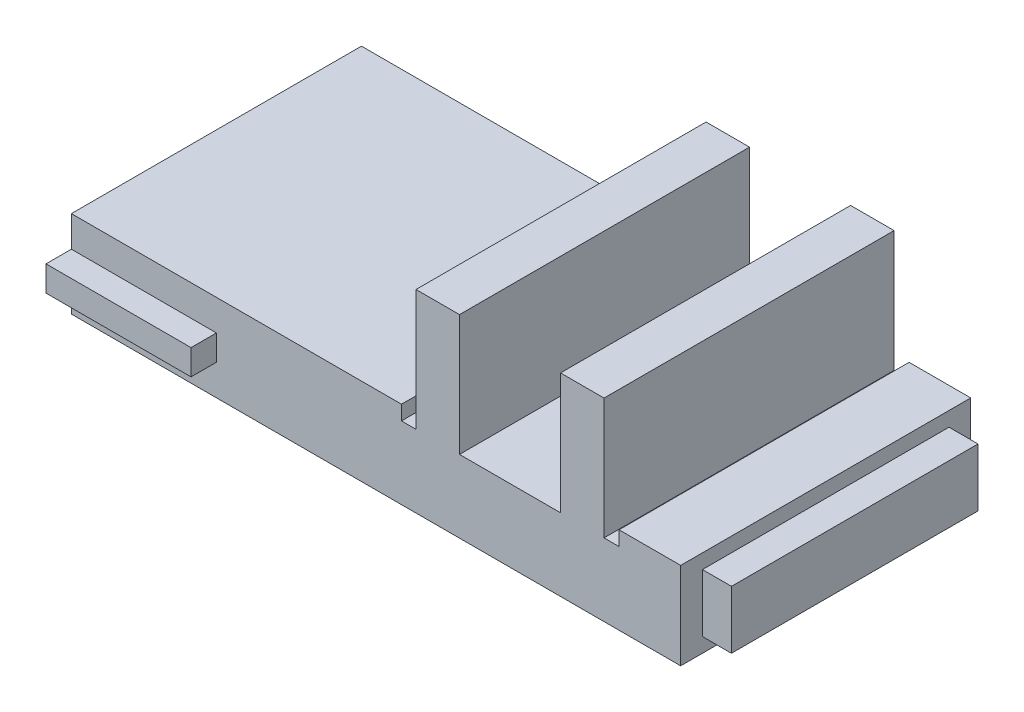
ISO-10303-21;
HEADER;
FILE_DESCRIPTION(('STEP AP214'),'2;1');
FILE_NAME('part.step','',(''),(''),'','','');
FILE_SCHEMA(('AUTOMOTIVE_DESIGN { 1 0 10303 214 1 1 1 1 }'));
ENDSEC;
DATA;
#1=APPLICATION_CONTEXT('core data for automotive mechanical design processes');
#2=APPLICATION_PROTOCOL_DEFINITION('international standard','automotive_design',2000,#1);
#3=PRODUCT_CONTEXT('',#1,'mechanical');
#4=PRODUCT('Part','Part','',(#3));
#5=PRODUCT_RELATED_PRODUCT_CATEGORY('part','',(#4));
#6=PRODUCT_DEFINITION_FORMATION('','',#4);
#7=PRODUCT_DEFINITION_CONTEXT('part definition',#1,'design');
#8=PRODUCT_DEFINITION('design','',#6,#7);
#9=PRODUCT_DEFINITION_SHAPE('','',#8);
#10=(LENGTH_UNIT() NAMED_UNIT(*) SI_UNIT(.MILLI.,.METRE.));
#11=(NAMED_UNIT(*) PLANE_ANGLE_UNIT() SI_UNIT($,.RADIAN.));
#12=(NAMED_UNIT(*) SI_UNIT($,.STERADIAN.) SOLID_ANGLE_UNIT());
#13=UNCERTAINTY_MEASURE_WITH_UNIT(LENGTH_MEASURE(1.E-05),#10,'distance_accuracy_value','');
#14=(GEOMETRIC_REPRESENTATION_CONTEXT(3) GLOBAL_UNCERTAINTY_ASSIGNED_CONTEXT((#13)) GLOBAL_UNIT_ASSIGNED_CONTEXT((#10,
#11,#12)) REPRESENTATION_CONTEXT('',''));
#15=CARTESIAN_POINT('',(0.,0.,0.));
#16=DIRECTION('',(0.,0.,1.));
#17=DIRECTION('',(1.,0.,0.));
#18=AXIS2_PLACEMENT_3D('',#15,#16,#17);
#19=CARTESIAN_POINT('',(0.,0.,0.));
#20=DIRECTION('',(0.,0.,1.));
#21=DIRECTION('',(1.,0.,0.));
#22=AXIS2_PLACEMENT_3D('',#19,#20,#21);
#23=PLANE('',#22);
#24=DIRECTION('',(-1.,0.,0.));
#25=VECTOR('',#24,1.);
#26=CARTESIAN_POINT('',(-20.26,-2.875,0.));
#27=LINE('',#26,#25);
#28=CARTESIAN_POINT('',(-20.26,-2.875,0.));
#29=VERTEX_POINT('',#28);
#30=CARTESIAN_POINT('',(-30.26,-2.875,0.));
#31=VERTEX_POINT('',#30);
#32=EDGE_CURVE('E301',#29,#31,#27,.T.);
#33=ORIENTED_EDGE('',*,*,#32,.F.);
#34=DIRECTION('',(0.,1.,0.));
#35=VECTOR('',#34,1.);
#36=CARTESIAN_POINT('',(-20.26,-1.125,0.));
#37=LINE('',#36,#35);
#38=CARTESIAN_POINT('',(-20.26,-1.125,0.));
#39=VERTEX_POINT('',#38);
#40=EDGE_CURVE('E274',#29,#39,#37,.T.);
#41=ORIENTED_EDGE('',*,*,#40,.T.);
#42=DIRECTION('',(-1.,0.,0.));
#43=VECTOR('',#42,1.);
#44=CARTESIAN_POINT('',(-20.26,-1.125,0.));
#45=LINE('',#44,#43);
#46=CARTESIAN_POINT('',(-30.26,-1.125,0.));
#47=VERTEX_POINT('',#46);
#48=EDGE_CURVE('E291',#39,#47,#45,.T.);
#49=ORIENTED_EDGE('',*,*,#48,.T.);
#50=DIRECTION('',(0.,-1.,0.));
#51=VECTOR('',#50,1.);
#52=CARTESIAN_POINT('',(-30.26,0.999999999999995,0.));
#53=LINE('',#52,#51);
#54=CARTESIAN_POINT('',(-30.26,0.999999999999995,0.));
#55=VERTEX_POINT('',#54);
#56=EDGE_CURVE('E470',#55,#47,#53,.T.);
#57=ORIENTED_EDGE('',*,*,#56,.F.);
#58=DIRECTION('',(-1.,0.,0.));
#59=VECTOR('',#58,1.);
#60=CARTESIAN_POINT('',(-7.5,0.999999999999998,0.));
#61=LINE('',#60,#59);
#62=CARTESIAN_POINT('',(-7.5,0.999999999999998,0.));
#63=VERTEX_POINT('',#62);
#64=EDGE_CURVE('E466',#63,#55,#61,.T.);
#65=ORIENTED_EDGE('',*,*,#64,.F.);
#66=DIRECTION('',(0.,1.,0.));
#67=VECTOR('',#66,1.);
#68=CARTESIAN_POINT('',(-7.5,0.,0.));
#69=LINE('',#68,#67);
#70=CARTESIAN_POINT('',(-7.5,0.,0.));
#71=VERTEX_POINT('',#70);
#72=EDGE_CURVE('E431',#71,#63,#69,.T.);
#73=ORIENTED_EDGE('',*,*,#72,.F.);
#74=DIRECTION('',(-1.,0.,0.));
#75=VECTOR('',#74,1.);
#76=CARTESIAN_POINT('',(7.5,0.,0.));
#77=LINE('',#76,#75);
#78=CARTESIAN_POINT('',(-6.5,0.,0.));
#79=VERTEX_POINT('',#78);
#80=EDGE_CURVE('E485',#79,#71,#77,.T.);
#81=ORIENTED_EDGE('',*,*,#80,.F.);
#82=DIRECTION('',(0.,-1.,0.));
#83=VECTOR('',#82,1.);
#84=CARTESIAN_POINT('',(-6.5,8.35,0.));
#85=LINE('',#84,#83);
#86=CARTESIAN_POINT('',(-6.5,8.35,0.));
#87=VERTEX_POINT('',#86);
#88=EDGE_CURVE('E378',#87,#79,#85,.T.);
#89=ORIENTED_EDGE('',*,*,#88,.F.);
#90=DIRECTION('',(-1.,0.,0.));
#91=VECTOR('',#90,1.);
#92=CARTESIAN_POINT('',(-6.5,8.35,0.));
#93=LINE('',#92,#91);
#94=CARTESIAN_POINT('',(-3.5,8.35,0.));
#95=VERTEX_POINT('',#94);
#96=EDGE_CURVE('E354',#95,#87,#93,.T.);
#97=ORIENTED_EDGE('',*,*,#96,.F.);
#98=DIRECTION('',(0.,-1.,0.));
#99=VECTOR('',#98,1.);
#100=CARTESIAN_POINT('',(-3.5,8.35,0.));
#101=LINE('',#100,#99);
#102=CARTESIAN_POINT('',(-3.5,0.,0.));
#103=VERTEX_POINT('',#102);
#104=EDGE_CURVE('E382',#95,#103,#101,.T.);
#105=ORIENTED_EDGE('',*,*,#104,.T.);
#106=CARTESIAN_POINT('',(3.46586818251866,0.,0.));
#107=VERTEX_POINT('',#106);
#108=EDGE_CURVE('E488',#107,#103,#77,.T.);
#109=ORIENTED_EDGE('',*,*,#108,.F.);
#110=DIRECTION('',(0.,-1.,0.));
#111=VECTOR('',#110,1.);
#112=CARTESIAN_POINT('',(3.46586818251866,8.35,0.));
#113=LINE('',#112,#111);
#114=CARTESIAN_POINT('',(3.46586818251866,8.35,0.));
#115=VERTEX_POINT('',#114);
#116=EDGE_CURVE('E316',#115,#107,#113,.T.);
#117=ORIENTED_EDGE('',*,*,#116,.F.);
#118=DIRECTION('',(-1.,0.,0.));
#119=VECTOR('',#118,1.);
#120=CARTESIAN_POINT('',(3.46586818251866,8.35,0.));
#121=LINE('',#120,#119);
#122=CARTESIAN_POINT('',(6.46586818251866,8.35,0.));
#123=VERTEX_POINT('',#122);
#124=EDGE_CURVE('E344',#123,#115,#121,.T.);
#125=ORIENTED_EDGE('',*,*,#124,.F.);
#126=DIRECTION('',(0.,-1.,0.));
#127=VECTOR('',#126,1.);
#128=CARTESIAN_POINT('',(6.46586818251866,8.35,0.));
#129=LINE('',#128,#127);
#130=CARTESIAN_POINT('',(6.46586818251867,0.,0.));
#131=VERTEX_POINT('',#130);
#132=EDGE_CURVE('E304',#123,#131,#129,.T.);
#133=ORIENTED_EDGE('',*,*,#132,.T.);
#134=CARTESIAN_POINT('',(7.5,0.,0.));
#135=VERTEX_POINT('',#134);
#136=EDGE_CURVE('E437',#135,#131,#77,.T.);
#137=ORIENTED_EDGE('',*,*,#136,.F.);
#138=DIRECTION('',(0.,-1.,0.));
#139=VECTOR('',#138,1.);
#140=CARTESIAN_POINT('',(7.5,1.,0.));
#141=LINE('',#140,#139);
#142=CARTESIAN_POINT('',(7.5,1.,0.));
#143=VERTEX_POINT('',#142);
#144=EDGE_CURVE('E482',#143,#135,#141,.T.);
#145=ORIENTED_EDGE('',*,*,#144,.F.);
#146=DIRECTION('',(-1.,0.,0.));
#147=VECTOR('',#146,1.);
#148=CARTESIAN_POINT('',(11.75,1.,0.));
#149=LINE('',#148,#147);
#150=CARTESIAN_POINT('',(11.75,1.,0.));
#151=VERTEX_POINT('',#150);
#152=EDGE_CURVE('E479',#151,#143,#149,.T.);
#153=ORIENTED_EDGE('',*,*,#152,.F.);
#154=DIRECTION('',(0.,1.,0.));
#155=VECTOR('',#154,1.);
#156=CARTESIAN_POINT('',(11.75,-5.,0.));
#157=LINE('',#156,#155);
#158=CARTESIAN_POINT('',(11.75,-5.,0.));
#159=VERTEX_POINT('',#158);
#160=EDGE_CURVE('E476',#159,#151,#157,.T.);
#161=ORIENTED_EDGE('',*,*,#160,.F.);
#162=DIRECTION('',(1.,0.,0.));
#163=VECTOR('',#162,1.);
#164=CARTESIAN_POINT('',(-30.26,-5.,0.));
#165=LINE('',#164,#163);
#166=CARTESIAN_POINT('',(-30.26,-5.,0.));
#167=VERTEX_POINT('',#166);
#168=EDGE_CURVE('E473',#167,#159,#165,.T.);
#169=ORIENTED_EDGE('',*,*,#168,.F.);
#170=EDGE_CURVE('E469',#31,#167,#53,.T.);
#171=ORIENTED_EDGE('',*,*,#170,.F.);
#172=EDGE_LOOP('',(#33,#41,#49,#57,#65,#73,#81,#89,#97,#105,#109,#117,#125,#133,#137,#145,#153,
#161,#169,#171));
#173=FACE_BOUND('',#172,.T.);
#174=ADVANCED_FACE('F45',(#173),#23,.F.);
#175=CARTESIAN_POINT('',(7.5,0.,20.));
#176=DIRECTION('',(0.,-1.,0.));
#177=DIRECTION('',(1.,0.,0.));
#178=AXIS2_PLACEMENT_3D('',#175,#176,#177);
#179=PLANE('',#178);
#180=DIRECTION('',(0.,0.,-1.));
#181=VECTOR('',#180,1.);
#182=CARTESIAN_POINT('',(6.46586818251866,0.,0.));
#183=LINE('',#182,#181);
#184=CARTESIAN_POINT('',(6.46586818251867,0.,20.));
#185=VERTEX_POINT('',#184);
#186=EDGE_CURVE('E333',#185,#131,#183,.T.);
#187=ORIENTED_EDGE('',*,*,#186,.F.);
#188=DIRECTION('',(-1.,0.,0.));
#189=VECTOR('',#188,1.);
#190=CARTESIAN_POINT('',(7.5,0.,20.));
#191=LINE('',#190,#189);
#192=CARTESIAN_POINT('',(7.5,0.,20.));
#193=VERTEX_POINT('',#192);
#194=EDGE_CURVE('E457',#193,#185,#191,.T.);
#195=ORIENTED_EDGE('',*,*,#194,.F.);
#196=DIRECTION('',(0.,0.,-1.));
#197=VECTOR('',#196,1.);
#198=CARTESIAN_POINT('',(7.5,0.,20.));
#199=LINE('',#198,#197);
#200=EDGE_CURVE('E492',#193,#135,#199,.T.);
#201=ORIENTED_EDGE('',*,*,#200,.T.);
#202=ORIENTED_EDGE('',*,*,#136,.T.);
#203=EDGE_LOOP('',(#187,#195,#201,#202));
#204=FACE_BOUND('',#203,.T.);
#205=ADVANCED_FACE('F586',(#204),#179,.F.);
#206=DIRECTION('',(0.,0.,1.));
#207=VECTOR('',#206,1.);
#208=CARTESIAN_POINT('',(3.46586818251866,0.,0.));
#209=LINE('',#208,#207);
#210=CARTESIAN_POINT('',(3.46586818251866,0.,20.));
#211=VERTEX_POINT('',#210);
#212=EDGE_CURVE('E329',#107,#211,#209,.T.);
#213=ORIENTED_EDGE('',*,*,#212,.F.);
#214=ORIENTED_EDGE('',*,*,#108,.T.);
#215=DIRECTION('',(0.,0.,-1.));
#216=VECTOR('',#215,1.);
#217=CARTESIAN_POINT('',(-3.5,0.,0.));
#218=LINE('',#217,#216);
#219=CARTESIAN_POINT('',(-3.5,0.,20.));
#220=VERTEX_POINT('',#219);
#221=EDGE_CURVE('E338',#220,#103,#218,.T.);
#222=ORIENTED_EDGE('',*,*,#221,.F.);
#223=EDGE_CURVE('E462',#211,#220,#191,.T.);
#224=ORIENTED_EDGE('',*,*,#223,.F.);
#225=EDGE_LOOP('',(#213,#214,#222,#224));
#226=FACE_BOUND('',#225,.T.);
#227=ADVANCED_FACE('F552',(#226),#179,.F.);
#228=DIRECTION('',(0.,0.,1.));
#229=VECTOR('',#228,1.);
#230=CARTESIAN_POINT('',(-6.5,0.,0.));
#231=LINE('',#230,#229);
#232=CARTESIAN_POINT('',(-6.5,0.,20.));
#233=VERTEX_POINT('',#232);
#234=EDGE_CURVE('E355',#79,#233,#231,.T.);
#235=ORIENTED_EDGE('',*,*,#234,.F.);
#236=ORIENTED_EDGE('',*,*,#80,.T.);
#237=DIRECTION('',(0.,0.,-1.));
#238=VECTOR('',#237,1.);
#239=CARTESIAN_POINT('',(-7.5,0.,20.));
#240=LINE('',#239,#238);
#241=CARTESIAN_POINT('',(-7.5,0.,20.));
#242=VERTEX_POINT('',#241);
#243=EDGE_CURVE('E461',#242,#71,#240,.T.);
#244=ORIENTED_EDGE('',*,*,#243,.F.);
#245=EDGE_CURVE('E456',#233,#242,#191,.T.);
#246=ORIENTED_EDGE('',*,*,#245,.F.);
#247=EDGE_LOOP('',(#235,#236,#244,#246));
#248=FACE_BOUND('',#247,.T.);
#249=ADVANCED_FACE('F566',(#248),#179,.F.);
#250=CARTESIAN_POINT('',(11.75,-5.,20.));
#251=DIRECTION('',(-1.,0.,0.));
#252=DIRECTION('',(0.,0.,1.));
#253=AXIS2_PLACEMENT_3D('',#250,#251,#252);
#254=PLANE('',#253);
#255=ORIENTED_EDGE('',*,*,#160,.T.);
#256=DIRECTION('',(0.,0.,-1.));
#257=VECTOR('',#256,1.);
#258=CARTESIAN_POINT('',(11.75,1.,20.));
#259=LINE('',#258,#257);
#260=CARTESIAN_POINT('',(11.75,1.,20.));
#261=VERTEX_POINT('',#260);
#262=EDGE_CURVE('E500',#261,#151,#259,.T.);
#263=ORIENTED_EDGE('',*,*,#262,.F.);
#264=DIRECTION('',(0.,1.,0.));
#265=VECTOR('',#264,1.);
#266=CARTESIAN_POINT('',(11.75,-5.,20.));
#267=LINE('',#266,#265);
#268=CARTESIAN_POINT('',(11.75,-5.,20.));
#269=VERTEX_POINT('',#268);
#270=EDGE_CURVE('E447',#269,#261,#267,.T.);
#271=ORIENTED_EDGE('',*,*,#270,.F.);
#272=DIRECTION('',(0.,0.,-1.));
#273=VECTOR('',#272,1.);
#274=CARTESIAN_POINT('',(11.75,-5.,20.));
#275=LINE('',#274,#273);
#276=EDGE_CURVE('E504',#269,#159,#275,.T.);
#277=ORIENTED_EDGE('',*,*,#276,.T.);
#278=EDGE_LOOP('',(#255,#263,#271,#277));
#279=FACE_BOUND('',#278,.T.);
#280=DIRECTION('',(0.,1.,0.));
#281=VECTOR('',#280,1.);
#282=CARTESIAN_POINT('',(11.75,0.,1.5));
#283=LINE('',#282,#281);
#284=CARTESIAN_POINT('',(11.75,-4.,1.5));
#285=VERTEX_POINT('',#284);
#286=CARTESIAN_POINT('',(11.75,0.,1.5));
#287=VERTEX_POINT('',#286);
#288=EDGE_CURVE('E386',#285,#287,#283,.T.);
#289=ORIENTED_EDGE('',*,*,#288,.F.);
#290=DIRECTION('',(0.,0.,-1.));
#291=VECTOR('',#290,1.);
#292=CARTESIAN_POINT('',(11.75,-4.,18.5));
#293=LINE('',#292,#291);
#294=CARTESIAN_POINT('',(11.75,-4.,18.5));
#295=VERTEX_POINT('',#294);
#296=EDGE_CURVE('E392',#295,#285,#293,.T.);
#297=ORIENTED_EDGE('',*,*,#296,.F.);
#298=DIRECTION('',(0.,-1.,0.));
#299=VECTOR('',#298,1.);
#300=CARTESIAN_POINT('',(11.75,0.,18.5));
#301=LINE('',#300,#299);
#302=CARTESIAN_POINT('',(11.75,0.,18.5));
#303=VERTEX_POINT('',#302);
#304=EDGE_CURVE('E409',#303,#295,#301,.T.);
#305=ORIENTED_EDGE('',*,*,#304,.F.);
#306=DIRECTION('',(0.,0.,1.));
#307=VECTOR('',#306,1.);
#308=CARTESIAN_POINT('',(11.75,0.,18.5));
#309=LINE('',#308,#307);
#310=EDGE_CURVE('E405',#287,#303,#309,.T.);
#311=ORIENTED_EDGE('',*,*,#310,.F.);
#312=EDGE_LOOP('',(#289,#297,#305,#311));
#313=FACE_BOUND('',#312,.T.);
#314=ADVANCED_FACE('F599',(#279,#313),#254,.F.);
#315=CARTESIAN_POINT('',(-7.5,0.,20.));
#316=DIRECTION('',(-1.,0.,0.));
#317=DIRECTION('',(0.,-1.,0.));
#318=AXIS2_PLACEMENT_3D('',#315,#316,#317);
#319=PLANE('',#318);
#320=ORIENTED_EDGE('',*,*,#72,.T.);
#321=DIRECTION('',(0.,0.,-1.));
#322=VECTOR('',#321,1.);
#323=CARTESIAN_POINT('',(-7.5,0.999999999999998,20.));
#324=LINE('',#323,#322);
#325=CARTESIAN_POINT('',(-7.5,0.999999999999998,20.));
#326=VERTEX_POINT('',#325);
#327=EDGE_CURVE('E11',#326,#63,#324,.T.);
#328=ORIENTED_EDGE('',*,*,#327,.F.);
#329=DIRECTION('',(0.,1.,0.));
#330=VECTOR('',#329,1.);
#331=CARTESIAN_POINT('',(-7.5,0.,20.));
#332=LINE('',#331,#330);
#333=EDGE_CURVE('E432',#242,#326,#332,.T.);
#334=ORIENTED_EDGE('',*,*,#333,.F.);
#335=ORIENTED_EDGE('',*,*,#243,.T.);
#336=EDGE_LOOP('',(#320,#328,#334,#335));
#337=FACE_BOUND('',#336,.T.);
#338=ADVANCED_FACE('F47',(#337),#319,.F.);
#339=CARTESIAN_POINT('',(-7.5,0.999999999999998,20.));
#340=DIRECTION('',(0.,-1.,0.));
#341=DIRECTION('',(1.,0.,0.));
#342=AXIS2_PLACEMENT_3D('',#339,#340,#341);
#343=PLANE('',#342);
#344=ORIENTED_EDGE('',*,*,#64,.T.);
#345=DIRECTION('',(0.,0.,-1.));
#346=VECTOR('',#345,1.);
#347=CARTESIAN_POINT('',(-30.26,0.999999999999995,20.));
#348=LINE('',#347,#346);
#349=CARTESIAN_POINT('',(-30.26,0.999999999999995,20.));
#350=VERTEX_POINT('',#349);
#351=EDGE_CURVE('E54',#350,#55,#348,.T.);
#352=ORIENTED_EDGE('',*,*,#351,.F.);
#353=DIRECTION('',(-1.,0.,0.));
#354=VECTOR('',#353,1.);
#355=CARTESIAN_POINT('',(-7.5,0.999999999999998,20.));
#356=LINE('',#355,#354);
#357=EDGE_CURVE('E436',#326,#350,#356,.T.);
#358=ORIENTED_EDGE('',*,*,#357,.F.);
#359=ORIENTED_EDGE('',*,*,#327,.T.);
#360=EDGE_LOOP('',(#344,#352,#358,#359));
#361=FACE_BOUND('',#360,.T.);
#362=ADVANCED_FACE('F570',(#361),#343,.F.);
#363=CARTESIAN_POINT('',(-30.26,0.999999999999995,20.));
#364=DIRECTION('',(1.,0.,0.));
#365=DIRECTION('',(0.,0.,-1.));
#366=AXIS2_PLACEMENT_3D('',#363,#364,#365);
#367=PLANE('',#366);
#368=ORIENTED_EDGE('',*,*,#56,.T.);
#369=DIRECTION('',(0.,0.,-1.));
#370=VECTOR('',#369,1.);
#371=CARTESIAN_POINT('',(-30.26,-1.125,-1.75));
#372=LINE('',#371,#370);
#373=CARTESIAN_POINT('',(-30.26,-1.125,-1.75));
#374=VERTEX_POINT('',#373);
#375=EDGE_CURVE('E69',#47,#374,#372,.T.);
#376=ORIENTED_EDGE('',*,*,#375,.T.);
#377=DIRECTION('',(0.,-1.,0.));
#378=VECTOR('',#377,1.);
#379=CARTESIAN_POINT('',(-30.26,-1.125,-1.75));
#380=LINE('',#379,#378);
#381=CARTESIAN_POINT('',(-30.26,-2.875,-1.75));
#382=VERTEX_POINT('',#381);
#383=EDGE_CURVE('E294',#374,#382,#380,.T.);
#384=ORIENTED_EDGE('',*,*,#383,.T.);
#385=DIRECTION('',(0.,0.,1.));
#386=VECTOR('',#385,1.);
#387=CARTESIAN_POINT('',(-30.26,-2.875,-1.75));
#388=LINE('',#387,#386);
#389=EDGE_CURVE('E279',#382,#31,#388,.T.);
#390=ORIENTED_EDGE('',*,*,#389,.T.);
#391=ORIENTED_EDGE('',*,*,#170,.T.);
#392=DIRECTION('',(0.,0.,-1.));
#393=VECTOR('',#392,1.);
#394=CARTESIAN_POINT('',(-30.26,-5.,20.));
#395=LINE('',#394,#393);
#396=CARTESIAN_POINT('',(-30.26,-5.,20.));
#397=VERTEX_POINT('',#396);
#398=EDGE_CURVE('E508',#397,#167,#395,.T.);
#399=ORIENTED_EDGE('',*,*,#398,.F.);
#400=DIRECTION('',(0.,-1.,0.));
#401=VECTOR('',#400,1.);
#402=CARTESIAN_POINT('',(-30.26,0.999999999999995,20.));
#403=LINE('',#402,#401);
#404=CARTESIAN_POINT('',(-30.26,-2.875,20.));
#405=VERTEX_POINT('',#404);
#406=EDGE_CURVE('E254',#405,#397,#403,.T.);
#407=ORIENTED_EDGE('',*,*,#406,.F.);
#408=DIRECTION('',(0.,0.,1.));
#409=VECTOR('',#408,1.);
#410=CARTESIAN_POINT('',(-30.26,-2.875,21.75));
#411=LINE('',#410,#409);
#412=CARTESIAN_POINT('',(-30.26,-2.875,21.75));
#413=VERTEX_POINT('',#412);
#414=EDGE_CURVE('E61',#405,#413,#411,.T.);
#415=ORIENTED_EDGE('',*,*,#414,.T.);
#416=DIRECTION('',(0.,1.,0.));
#417=VECTOR('',#416,1.);
#418=CARTESIAN_POINT('',(-30.26,-1.125,21.75));
#419=LINE('',#418,#417);
#420=CARTESIAN_POINT('',(-30.26,-1.125,21.75));
#421=VERTEX_POINT('',#420);
#422=EDGE_CURVE('E241',#413,#421,#419,.T.);
#423=ORIENTED_EDGE('',*,*,#422,.T.);
#424=DIRECTION('',(0.,0.,-1.));
#425=VECTOR('',#424,1.);
#426=CARTESIAN_POINT('',(-30.26,-1.125,21.75));
#427=LINE('',#426,#425);
#428=CARTESIAN_POINT('',(-30.26,-1.125,20.));
#429=VERTEX_POINT('',#428);
#430=EDGE_CURVE('E248',#421,#429,#427,.T.);
#431=ORIENTED_EDGE('',*,*,#430,.T.);
#432=EDGE_CURVE('E440',#350,#429,#403,.T.);
#433=ORIENTED_EDGE('',*,*,#432,.F.);
#434=ORIENTED_EDGE('',*,*,#351,.T.);
#435=EDGE_LOOP('',(#368,#376,#384,#390,#391,#399,#407,#415,#423,#431,#433,#434));
#436=FACE_BOUND('',#435,.T.);
#437=ADVANCED_FACE('F252',(#436),#367,.F.);
#438=CARTESIAN_POINT('',(-30.26,-5.,20.));
#439=DIRECTION('',(0.,1.,0.));
#440=DIRECTION('',(0.,0.,1.));
#441=AXIS2_PLACEMENT_3D('',#438,#439,#440);
#442=PLANE('',#441);
#443=ORIENTED_EDGE('',*,*,#168,.T.);
#444=ORIENTED_EDGE('',*,*,#276,.F.);
#445=DIRECTION('',(1.,0.,0.));
#446=VECTOR('',#445,1.);
#447=CARTESIAN_POINT('',(-30.26,-5.,20.));
#448=LINE('',#447,#446);
#449=EDGE_CURVE('E444',#397,#269,#448,.T.);
#450=ORIENTED_EDGE('',*,*,#449,.F.);
#451=ORIENTED_EDGE('',*,*,#398,.T.);
#452=EDGE_LOOP('',(#443,#444,#450,#451));
#453=FACE_BOUND('',#452,.T.);
#454=ADVANCED_FACE('F604',(#453),#442,.F.);
#455=CARTESIAN_POINT('',(11.75,1.,20.));
#456=DIRECTION('',(0.,-1.,0.));
#457=DIRECTION('',(1.,0.,0.));
#458=AXIS2_PLACEMENT_3D('',#455,#456,#457);
#459=PLANE('',#458);
#460=ORIENTED_EDGE('',*,*,#152,.T.);
#461=DIRECTION('',(0.,0.,-1.));
#462=VECTOR('',#461,1.);
#463=CARTESIAN_POINT('',(7.5,1.,20.));
#464=LINE('',#463,#462);
#465=CARTESIAN_POINT('',(7.5,1.,20.));
#466=VERTEX_POINT('',#465);
#467=EDGE_CURVE('E496',#466,#143,#464,.T.);
#468=ORIENTED_EDGE('',*,*,#467,.F.);
#469=DIRECTION('',(-1.,0.,0.));
#470=VECTOR('',#469,1.);
#471=CARTESIAN_POINT('',(11.75,1.,20.));
#472=LINE('',#471,#470);
#473=EDGE_CURVE('E450',#261,#466,#472,.T.);
#474=ORIENTED_EDGE('',*,*,#473,.F.);
#475=ORIENTED_EDGE('',*,*,#262,.T.);
#476=EDGE_LOOP('',(#460,#468,#474,#475));
#477=FACE_BOUND('',#476,.T.);
#478=ADVANCED_FACE('F595',(#477),#459,.F.);
#479=CARTESIAN_POINT('',(7.5,1.,20.));
#480=DIRECTION('',(1.,0.,0.));
#481=DIRECTION('',(0.,1.,0.));
#482=AXIS2_PLACEMENT_3D('',#479,#480,#481);
#483=PLANE('',#482);
#484=ORIENTED_EDGE('',*,*,#144,.T.);
#485=ORIENTED_EDGE('',*,*,#200,.F.);
#486=DIRECTION('',(0.,-1.,0.));
#487=VECTOR('',#486,1.);
#488=CARTESIAN_POINT('',(7.5,1.,20.));
#489=LINE('',#488,#487);
#490=EDGE_CURVE('E453',#466,#193,#489,.T.);
#491=ORIENTED_EDGE('',*,*,#490,.F.);
#492=ORIENTED_EDGE('',*,*,#467,.T.);
#493=EDGE_LOOP('',(#484,#485,#491,#492));
#494=FACE_BOUND('',#493,.T.);
#495=ADVANCED_FACE('F592',(#494),#483,.F.);
#496=CARTESIAN_POINT('',(0.,0.,20.));
#497=DIRECTION('',(0.,0.,1.));
#498=DIRECTION('',(1.,0.,0.));
#499=AXIS2_PLACEMENT_3D('',#496,#497,#498);
#500=PLANE('',#499);
#501=DIRECTION('',(-1.,0.,0.));
#502=VECTOR('',#501,1.);
#503=CARTESIAN_POINT('',(-20.26,-1.125,20.));
#504=LINE('',#503,#502);
#505=CARTESIAN_POINT('',(-20.26,-1.125,20.));
#506=VERTEX_POINT('',#505);
#507=EDGE_CURVE('E606',#506,#429,#504,.T.);
#508=ORIENTED_EDGE('',*,*,#507,.F.);
#509=DIRECTION('',(0.,-1.,0.));
#510=VECTOR('',#509,1.);
#511=CARTESIAN_POINT('',(-20.26,-1.125,20.));
#512=LINE('',#511,#510);
#513=CARTESIAN_POINT('',(-20.26,-2.875,20.));
#514=VERTEX_POINT('',#513);
#515=EDGE_CURVE('E267',#506,#514,#512,.T.);
#516=ORIENTED_EDGE('',*,*,#515,.T.);
#517=DIRECTION('',(-1.,0.,0.));
#518=VECTOR('',#517,1.);
#519=CARTESIAN_POINT('',(-20.26,-2.875,20.));
#520=LINE('',#519,#518);
#521=EDGE_CURVE('E238',#514,#405,#520,.T.);
#522=ORIENTED_EDGE('',*,*,#521,.T.);
#523=ORIENTED_EDGE('',*,*,#406,.T.);
#524=ORIENTED_EDGE('',*,*,#449,.T.);
#525=ORIENTED_EDGE('',*,*,#270,.T.);
#526=ORIENTED_EDGE('',*,*,#473,.T.);
#527=ORIENTED_EDGE('',*,*,#490,.T.);
#528=ORIENTED_EDGE('',*,*,#194,.T.);
#529=DIRECTION('',(0.,-1.,0.));
#530=VECTOR('',#529,1.);
#531=CARTESIAN_POINT('',(6.46586818251866,8.35,20.));
#532=LINE('',#531,#530);
#533=CARTESIAN_POINT('',(6.46586818251866,8.35,20.));
#534=VERTEX_POINT('',#533);
#535=EDGE_CURVE('E324',#534,#185,#532,.T.);
#536=ORIENTED_EDGE('',*,*,#535,.F.);
#537=DIRECTION('',(1.,0.,0.));
#538=VECTOR('',#537,1.);
#539=CARTESIAN_POINT('',(3.46586818251866,8.35,20.));
#540=LINE('',#539,#538);
#541=CARTESIAN_POINT('',(3.46586818251866,8.35,20.));
#542=VERTEX_POINT('',#541);
#543=EDGE_CURVE('E328',#542,#534,#540,.T.);
#544=ORIENTED_EDGE('',*,*,#543,.F.);
#545=DIRECTION('',(0.,-1.,0.));
#546=VECTOR('',#545,1.);
#547=CARTESIAN_POINT('',(3.46586818251866,8.35,20.));
#548=LINE('',#547,#546);
#549=EDGE_CURVE('E320',#542,#211,#548,.T.);
#550=ORIENTED_EDGE('',*,*,#549,.T.);
#551=ORIENTED_EDGE('',*,*,#223,.T.);
#552=DIRECTION('',(0.,-1.,0.));
#553=VECTOR('',#552,1.);
#554=CARTESIAN_POINT('',(-3.5,8.35,20.));
#555=LINE('',#554,#553);
#556=CARTESIAN_POINT('',(-3.5,8.35,20.));
#557=VERTEX_POINT('',#556);
#558=EDGE_CURVE('E364',#557,#220,#555,.T.);
#559=ORIENTED_EDGE('',*,*,#558,.F.);
#560=DIRECTION('',(1.,0.,0.));
#561=VECTOR('',#560,1.);
#562=CARTESIAN_POINT('',(-6.5,8.35,20.));
#563=LINE('',#562,#561);
#564=CARTESIAN_POINT('',(-6.5,8.35,20.));
#565=VERTEX_POINT('',#564);
#566=EDGE_CURVE('E361',#565,#557,#563,.T.);
#567=ORIENTED_EDGE('',*,*,#566,.F.);
#568=DIRECTION('',(0.,-1.,0.));
#569=VECTOR('',#568,1.);
#570=CARTESIAN_POINT('',(-6.5,8.35,20.));
#571=LINE('',#570,#569);
#572=EDGE_CURVE('E374',#565,#233,#571,.T.);
#573=ORIENTED_EDGE('',*,*,#572,.T.);
#574=ORIENTED_EDGE('',*,*,#245,.T.);
#575=ORIENTED_EDGE('',*,*,#333,.T.);
#576=ORIENTED_EDGE('',*,*,#357,.T.);
#577=ORIENTED_EDGE('',*,*,#432,.T.);
#578=EDGE_LOOP('',(#508,#516,#522,#523,#524,#525,#526,#527,#528,#536,#544,#550,#551,#559,#567,
#573,#574,#575,#576,#577));
#579=FACE_BOUND('',#578,.T.);
#580=ADVANCED_FACE('F545',(#579),#500,.T.);
#581=CARTESIAN_POINT('',(13.75,0.,1.5));
#582=DIRECTION('',(0.,0.,1.));
#583=DIRECTION('',(1.,0.,0.));
#584=AXIS2_PLACEMENT_3D('',#581,#582,#583);
#585=PLANE('',#584);
#586=ORIENTED_EDGE('',*,*,#288,.T.);
#587=DIRECTION('',(-1.,0.,0.));
#588=VECTOR('',#587,1.);
#589=CARTESIAN_POINT('',(13.75,0.,1.5));
#590=LINE('',#589,#588);
#591=CARTESIAN_POINT('',(13.75,0.,1.5));
#592=VERTEX_POINT('',#591);
#593=EDGE_CURVE('E427',#592,#287,#590,.T.);
#594=ORIENTED_EDGE('',*,*,#593,.F.);
#595=DIRECTION('',(0.,1.,0.));
#596=VECTOR('',#595,1.);
#597=CARTESIAN_POINT('',(13.75,0.,1.5));
#598=LINE('',#597,#596);
#599=CARTESIAN_POINT('',(13.75,-4.,1.5));
#600=VERTEX_POINT('',#599);
#601=EDGE_CURVE('E387',#600,#592,#598,.T.);
#602=ORIENTED_EDGE('',*,*,#601,.F.);
#603=DIRECTION('',(-1.,0.,0.));
#604=VECTOR('',#603,1.);
#605=CARTESIAN_POINT('',(13.75,-4.,1.5));
#606=LINE('',#605,#604);
#607=EDGE_CURVE('E401',#600,#285,#606,.T.);
#608=ORIENTED_EDGE('',*,*,#607,.T.);
#609=EDGE_LOOP('',(#586,#594,#602,#608));
#610=FACE_BOUND('',#609,.T.);
#611=ADVANCED_FACE('F700',(#610),#585,.F.);
#612=CARTESIAN_POINT('',(13.75,0.,18.5));
#613=DIRECTION('',(0.,-1.,0.));
#614=DIRECTION('',(0.,0.,-1.));
#615=AXIS2_PLACEMENT_3D('',#612,#613,#614);
#616=PLANE('',#615);
#617=ORIENTED_EDGE('',*,*,#310,.T.);
#618=DIRECTION('',(-1.,0.,0.));
#619=VECTOR('',#618,1.);
#620=CARTESIAN_POINT('',(13.75,0.,18.5));
#621=LINE('',#620,#619);
#622=CARTESIAN_POINT('',(13.75,0.,18.5));
#623=VERTEX_POINT('',#622);
#624=EDGE_CURVE('E423',#623,#303,#621,.T.);
#625=ORIENTED_EDGE('',*,*,#624,.F.);
#626=DIRECTION('',(0.,0.,1.));
#627=VECTOR('',#626,1.);
#628=CARTESIAN_POINT('',(13.75,0.,18.5));
#629=LINE('',#628,#627);
#630=EDGE_CURVE('E391',#592,#623,#629,.T.);
#631=ORIENTED_EDGE('',*,*,#630,.F.);
#632=ORIENTED_EDGE('',*,*,#593,.T.);
#633=EDGE_LOOP('',(#617,#625,#631,#632));
#634=FACE_BOUND('',#633,.T.);
#635=ADVANCED_FACE('F846',(#634),#616,.F.);
#636=CARTESIAN_POINT('',(13.75,0.,18.5));
#637=DIRECTION('',(0.,0.,-1.));
#638=DIRECTION('',(-1.,0.,0.));
#639=AXIS2_PLACEMENT_3D('',#636,#637,#638);
#640=PLANE('',#639);
#641=ORIENTED_EDGE('',*,*,#304,.T.);
#642=DIRECTION('',(-1.,0.,0.));
#643=VECTOR('',#642,1.);
#644=CARTESIAN_POINT('',(13.75,-4.,18.5));
#645=LINE('',#644,#643);
#646=CARTESIAN_POINT('',(13.75,-4.,18.5));
#647=VERTEX_POINT('',#646);
#648=EDGE_CURVE('E419',#647,#295,#645,.T.);
#649=ORIENTED_EDGE('',*,*,#648,.F.);
#650=DIRECTION('',(0.,-1.,0.));
#651=VECTOR('',#650,1.);
#652=CARTESIAN_POINT('',(13.75,0.,18.5));
#653=LINE('',#652,#651);
#654=EDGE_CURVE('E395',#623,#647,#653,.T.);
#655=ORIENTED_EDGE('',*,*,#654,.F.);
#656=ORIENTED_EDGE('',*,*,#624,.T.);
#657=EDGE_LOOP('',(#641,#649,#655,#656));
#658=FACE_BOUND('',#657,.T.);
#659=ADVANCED_FACE('F838',(#658),#640,.F.);
#660=CARTESIAN_POINT('',(13.75,-4.,18.5));
#661=DIRECTION('',(0.,1.,0.));
#662=DIRECTION('',(0.,0.,1.));
#663=AXIS2_PLACEMENT_3D('',#660,#661,#662);
#664=PLANE('',#663);
#665=ORIENTED_EDGE('',*,*,#296,.T.);
#666=ORIENTED_EDGE('',*,*,#607,.F.);
#667=DIRECTION('',(0.,0.,-1.));
#668=VECTOR('',#667,1.);
#669=CARTESIAN_POINT('',(13.75,-4.,18.5));
#670=LINE('',#669,#668);
#671=EDGE_CURVE('E398',#647,#600,#670,.T.);
#672=ORIENTED_EDGE('',*,*,#671,.F.);
#673=ORIENTED_EDGE('',*,*,#648,.T.);
#674=EDGE_LOOP('',(#665,#666,#672,#673));
#675=FACE_BOUND('',#674,.T.);
#676=ADVANCED_FACE('F831',(#675),#664,.F.);
#677=CARTESIAN_POINT('',(13.75,0.,0.));
#678=DIRECTION('',(1.,0.,0.));
#679=DIRECTION('',(0.,0.,-1.));
#680=AXIS2_PLACEMENT_3D('',#677,#678,#679);
#681=PLANE('',#680);
#682=ORIENTED_EDGE('',*,*,#601,.T.);
#683=ORIENTED_EDGE('',*,*,#630,.T.);
#684=ORIENTED_EDGE('',*,*,#654,.T.);
#685=ORIENTED_EDGE('',*,*,#671,.T.);
#686=EDGE_LOOP('',(#682,#683,#684,#685));
#687=FACE_BOUND('',#686,.T.);
#688=ADVANCED_FACE('F824',(#687),#681,.T.);
#689=CARTESIAN_POINT('',(-3.5,8.35,0.));
#690=DIRECTION('',(-1.,0.,0.));
#691=DIRECTION('',(0.,-1.,0.));
#692=AXIS2_PLACEMENT_3D('',#689,#690,#691);
#693=PLANE('',#692);
#694=ORIENTED_EDGE('',*,*,#221,.T.);
#695=ORIENTED_EDGE('',*,*,#104,.F.);
#696=DIRECTION('',(0.,0.,-1.));
#697=VECTOR('',#696,1.);
#698=CARTESIAN_POINT('',(-3.5,8.35,0.));
#699=LINE('',#698,#697);
#700=EDGE_CURVE('E350',#557,#95,#699,.T.);
#701=ORIENTED_EDGE('',*,*,#700,.F.);
#702=ORIENTED_EDGE('',*,*,#558,.T.);
#703=EDGE_LOOP('',(#694,#695,#701,#702));
#704=FACE_BOUND('',#703,.T.);
#705=ADVANCED_FACE('F555',(#704),#693,.F.);
#706=CARTESIAN_POINT('',(-6.5,8.35,0.));
#707=DIRECTION('',(1.,0.,0.));
#708=DIRECTION('',(0.,1.,0.));
#709=AXIS2_PLACEMENT_3D('',#706,#707,#708);
#710=PLANE('',#709);
#711=ORIENTED_EDGE('',*,*,#234,.T.);
#712=ORIENTED_EDGE('',*,*,#572,.F.);
#713=DIRECTION('',(0.,0.,1.));
#714=VECTOR('',#713,1.);
#715=CARTESIAN_POINT('',(-6.5,8.35,0.));
#716=LINE('',#715,#714);
#717=EDGE_CURVE('E358',#87,#565,#716,.T.);
#718=ORIENTED_EDGE('',*,*,#717,.F.);
#719=ORIENTED_EDGE('',*,*,#88,.T.);
#720=EDGE_LOOP('',(#711,#712,#718,#719));
#721=FACE_BOUND('',#720,.T.);
#722=ADVANCED_FACE('F563',(#721),#710,.F.);
#723=CARTESIAN_POINT('',(0.,8.35,0.));
#724=DIRECTION('',(0.,1.,0.));
#725=DIRECTION('',(-1.,0.,0.));
#726=AXIS2_PLACEMENT_3D('',#723,#724,#725);
#727=PLANE('',#726);
#728=ORIENTED_EDGE('',*,*,#700,.T.);
#729=ORIENTED_EDGE('',*,*,#96,.T.);
#730=ORIENTED_EDGE('',*,*,#717,.T.);
#731=ORIENTED_EDGE('',*,*,#566,.T.);
#732=EDGE_LOOP('',(#728,#729,#730,#731));
#733=FACE_BOUND('',#732,.T.);
#734=ADVANCED_FACE('F557',(#733),#727,.T.);
#735=CARTESIAN_POINT('',(6.46586818251866,8.35,0.));
#736=DIRECTION('',(-1.,0.,0.));
#737=DIRECTION('',(0.,-1.,0.));
#738=AXIS2_PLACEMENT_3D('',#735,#736,#737);
#739=PLANE('',#738);
#740=ORIENTED_EDGE('',*,*,#186,.T.);
#741=ORIENTED_EDGE('',*,*,#132,.F.);
#742=DIRECTION('',(0.,0.,-1.));
#743=VECTOR('',#742,1.);
#744=CARTESIAN_POINT('',(6.46586818251866,8.35,0.));
#745=LINE('',#744,#743);
#746=EDGE_CURVE('E334',#534,#123,#745,.T.);
#747=ORIENTED_EDGE('',*,*,#746,.F.);
#748=ORIENTED_EDGE('',*,*,#535,.T.);
#749=EDGE_LOOP('',(#740,#741,#747,#748));
#750=FACE_BOUND('',#749,.T.);
#751=ADVANCED_FACE('F583',(#750),#739,.F.);
#752=CARTESIAN_POINT('',(3.46586818251866,8.35,0.));
#753=DIRECTION('',(1.,0.,0.));
#754=DIRECTION('',(0.,1.,0.));
#755=AXIS2_PLACEMENT_3D('',#752,#753,#754);
#756=PLANE('',#755);
#757=ORIENTED_EDGE('',*,*,#212,.T.);
#758=ORIENTED_EDGE('',*,*,#549,.F.);
#759=DIRECTION('',(0.,0.,1.));
#760=VECTOR('',#759,1.);
#761=CARTESIAN_POINT('',(3.46586818251866,8.35,0.));
#762=LINE('',#761,#760);
#763=EDGE_CURVE('E341',#115,#542,#762,.T.);
#764=ORIENTED_EDGE('',*,*,#763,.F.);
#765=ORIENTED_EDGE('',*,*,#116,.T.);
#766=EDGE_LOOP('',(#757,#758,#764,#765));
#767=FACE_BOUND('',#766,.T.);
#768=ADVANCED_FACE('F574',(#767),#756,.F.);
#769=CARTESIAN_POINT('',(0.,8.35,0.));
#770=DIRECTION('',(0.,1.,0.));
#771=DIRECTION('',(-1.,0.,0.));
#772=AXIS2_PLACEMENT_3D('',#769,#770,#771);
#773=PLANE('',#772);
#774=ORIENTED_EDGE('',*,*,#746,.T.);
#775=ORIENTED_EDGE('',*,*,#124,.T.);
#776=ORIENTED_EDGE('',*,*,#763,.T.);
#777=ORIENTED_EDGE('',*,*,#543,.T.);
#778=EDGE_LOOP('',(#774,#775,#776,#777));
#779=FACE_BOUND('',#778,.T.);
#780=ADVANCED_FACE('F576',(#779),#773,.T.);
#781=CARTESIAN_POINT('',(-20.26,-2.875,-1.75));
#782=DIRECTION('',(0.,-1.,0.));
#783=DIRECTION('',(0.,0.,-1.));
#784=AXIS2_PLACEMENT_3D('',#781,#782,#783);
#785=PLANE('',#784);
#786=ORIENTED_EDGE('',*,*,#389,.F.);
#787=DIRECTION('',(-1.,0.,0.));
#788=VECTOR('',#787,1.);
#789=CARTESIAN_POINT('',(-20.26,-2.875,-1.75));
#790=LINE('',#789,#788);
#791=CARTESIAN_POINT('',(-20.26,-2.875,-1.75));
#792=VERTEX_POINT('',#791);
#793=EDGE_CURVE('E305',#792,#382,#790,.T.);
#794=ORIENTED_EDGE('',*,*,#793,.F.);
#795=DIRECTION('',(0.,0.,1.));
#796=VECTOR('',#795,1.);
#797=CARTESIAN_POINT('',(-20.26,-2.875,-1.75));
#798=LINE('',#797,#796);
#799=EDGE_CURVE('E287',#792,#29,#798,.T.);
#800=ORIENTED_EDGE('',*,*,#799,.T.);
#801=ORIENTED_EDGE('',*,*,#32,.T.);
#802=EDGE_LOOP('',(#786,#794,#800,#801));
#803=FACE_BOUND('',#802,.T.);
#804=ADVANCED_FACE('F532',(#803),#785,.T.);
#805=CARTESIAN_POINT('',(-20.26,-1.125,-1.75));
#806=DIRECTION('',(0.,0.,-1.));
#807=DIRECTION('',(0.,1.,0.));
#808=AXIS2_PLACEMENT_3D('',#805,#806,#807);
#809=PLANE('',#808);
#810=ORIENTED_EDGE('',*,*,#383,.F.);
#811=DIRECTION('',(-1.,0.,0.));
#812=VECTOR('',#811,1.);
#813=CARTESIAN_POINT('',(-20.26,-1.125,-1.75));
#814=LINE('',#813,#812);
#815=CARTESIAN_POINT('',(-20.26,-1.125,-1.75));
#816=VERTEX_POINT('',#815);
#817=EDGE_CURVE('E308',#816,#374,#814,.T.);
#818=ORIENTED_EDGE('',*,*,#817,.F.);
#819=DIRECTION('',(0.,-1.,0.));
#820=VECTOR('',#819,1.);
#821=CARTESIAN_POINT('',(-20.26,-1.125,-1.75));
#822=LINE('',#821,#820);
#823=EDGE_CURVE('E283',#816,#792,#822,.T.);
#824=ORIENTED_EDGE('',*,*,#823,.T.);
#825=ORIENTED_EDGE('',*,*,#793,.T.);
#826=EDGE_LOOP('',(#810,#818,#824,#825));
#827=FACE_BOUND('',#826,.T.);
#828=ADVANCED_FACE('F528',(#827),#809,.T.);
#829=CARTESIAN_POINT('',(-20.26,-1.125,-1.75));
#830=DIRECTION('',(0.,1.,0.));
#831=DIRECTION('',(0.,0.,1.));
#832=AXIS2_PLACEMENT_3D('',#829,#830,#831);
#833=PLANE('',#832);
#834=ORIENTED_EDGE('',*,*,#375,.F.);
#835=ORIENTED_EDGE('',*,*,#48,.F.);
#836=DIRECTION('',(0.,0.,-1.));
#837=VECTOR('',#836,1.);
#838=CARTESIAN_POINT('',(-20.26,-1.125,-1.75));
#839=LINE('',#838,#837);
#840=EDGE_CURVE('E278',#39,#816,#839,.T.);
#841=ORIENTED_EDGE('',*,*,#840,.T.);
#842=ORIENTED_EDGE('',*,*,#817,.T.);
#843=EDGE_LOOP('',(#834,#835,#841,#842));
#844=FACE_BOUND('',#843,.T.);
#845=ADVANCED_FACE('F521',(#844),#833,.T.);
#846=CARTESIAN_POINT('',(-20.26,0.,0.));
#847=DIRECTION('',(-1.,0.,0.));
#848=DIRECTION('',(0.,0.,1.));
#849=AXIS2_PLACEMENT_3D('',#846,#847,#848);
#850=PLANE('',#849);
#851=ORIENTED_EDGE('',*,*,#40,.F.);
#852=ORIENTED_EDGE('',*,*,#799,.F.);
#853=ORIENTED_EDGE('',*,*,#823,.F.);
#854=ORIENTED_EDGE('',*,*,#840,.F.);
#855=EDGE_LOOP('',(#851,#852,#853,#854));
#856=FACE_BOUND('',#855,.T.);
#857=ADVANCED_FACE('F524',(#856),#850,.F.);
#858=CARTESIAN_POINT('',(-20.26,-1.125,21.75));
#859=DIRECTION('',(0.,0.,1.));
#860=DIRECTION('',(1.,0.,0.));
#861=AXIS2_PLACEMENT_3D('',#858,#859,#860);
#862=PLANE('',#861);
#863=ORIENTED_EDGE('',*,*,#422,.F.);
#864=DIRECTION('',(-1.,0.,0.));
#865=VECTOR('',#864,1.);
#866=CARTESIAN_POINT('',(-20.26,-2.875,21.75));
#867=LINE('',#866,#865);
#868=CARTESIAN_POINT('',(-20.26,-2.875,21.75));
#869=VERTEX_POINT('',#868);
#870=EDGE_CURVE('E229',#869,#413,#867,.T.);
#871=ORIENTED_EDGE('',*,*,#870,.F.);
#872=DIRECTION('',(0.,1.,0.));
#873=VECTOR('',#872,1.);
#874=CARTESIAN_POINT('',(-20.26,-1.125,21.75));
#875=LINE('',#874,#873);
#876=CARTESIAN_POINT('',(-20.26,-1.125,21.75));
#877=VERTEX_POINT('',#876);
#878=EDGE_CURVE('E256',#869,#877,#875,.T.);
#879=ORIENTED_EDGE('',*,*,#878,.T.);
#880=DIRECTION('',(-1.,0.,0.));
#881=VECTOR('',#880,1.);
#882=CARTESIAN_POINT('',(-20.26,-1.125,21.75));
#883=LINE('',#882,#881);
#884=EDGE_CURVE('E243',#877,#421,#883,.T.);
#885=ORIENTED_EDGE('',*,*,#884,.T.);
#886=EDGE_LOOP('',(#863,#871,#879,#885));
#887=FACE_BOUND('',#886,.T.);
#888=ADVANCED_FACE('F242',(#887),#862,.T.);
#889=CARTESIAN_POINT('',(-20.26,-2.875,21.75));
#890=DIRECTION('',(0.,-1.,0.));
#891=DIRECTION('',(0.,0.,-1.));
#892=AXIS2_PLACEMENT_3D('',#889,#890,#891);
#893=PLANE('',#892);
#894=ORIENTED_EDGE('',*,*,#414,.F.);
#895=ORIENTED_EDGE('',*,*,#521,.F.);
#896=DIRECTION('',(0.,0.,1.));
#897=VECTOR('',#896,1.);
#898=CARTESIAN_POINT('',(-20.26,-2.875,21.75));
#899=LINE('',#898,#897);
#900=EDGE_CURVE('E233',#514,#869,#899,.T.);
#901=ORIENTED_EDGE('',*,*,#900,.T.);
#902=ORIENTED_EDGE('',*,*,#870,.T.);
#903=EDGE_LOOP('',(#894,#895,#901,#902));
#904=FACE_BOUND('',#903,.T.);
#905=ADVANCED_FACE('F231',(#904),#893,.T.);
#906=CARTESIAN_POINT('',(-20.26,-1.125,21.75));
#907=DIRECTION('',(0.,1.,0.));
#908=DIRECTION('',(0.,0.,1.));
#909=AXIS2_PLACEMENT_3D('',#906,#907,#908);
#910=PLANE('',#909);
#911=ORIENTED_EDGE('',*,*,#430,.F.);
#912=ORIENTED_EDGE('',*,*,#884,.F.);
#913=DIRECTION('',(0.,0.,-1.));
#914=VECTOR('',#913,1.);
#915=CARTESIAN_POINT('',(-20.26,-1.125,21.75));
#916=LINE('',#915,#914);
#917=EDGE_CURVE('E261',#877,#506,#916,.T.);
#918=ORIENTED_EDGE('',*,*,#917,.T.);
#919=ORIENTED_EDGE('',*,*,#507,.T.);
#920=EDGE_LOOP('',(#911,#912,#918,#919));
#921=FACE_BOUND('',#920,.T.);
#922=ADVANCED_FACE('F612',(#921),#910,.T.);
#923=CARTESIAN_POINT('',(-20.26,0.,0.));
#924=DIRECTION('',(1.,0.,0.));
#925=DIRECTION('',(0.,0.,-1.));
#926=AXIS2_PLACEMENT_3D('',#923,#924,#925);
#927=PLANE('',#926);
#928=ORIENTED_EDGE('',*,*,#878,.F.);
#929=ORIENTED_EDGE('',*,*,#900,.F.);
#930=ORIENTED_EDGE('',*,*,#515,.F.);
#931=ORIENTED_EDGE('',*,*,#917,.F.);
#932=EDGE_LOOP('',(#928,#929,#930,#931));
#933=FACE_BOUND('',#932,.T.);
#934=ADVANCED_FACE('F615',(#933),#927,.T.);
#935=CLOSED_SHELL('',(#174,#205,#227,#249,#314,#338,#362,#437,#454,#478,#495,#580,#611,#635,
#659,#676,#688,#705,#722,#734,#751,#768,#780,#804,#828,#845,#857,#888,#905,#922,#934));
#936=MANIFOLD_SOLID_BREP('B2',#935);
#937=ADVANCED_BREP_SHAPE_REPRESENTATION('',(#18,#936),#14);
#938=SHAPE_DEFINITION_REPRESENTATION(#9,#937);
ENDSEC;
END-ISO-10303-21;
